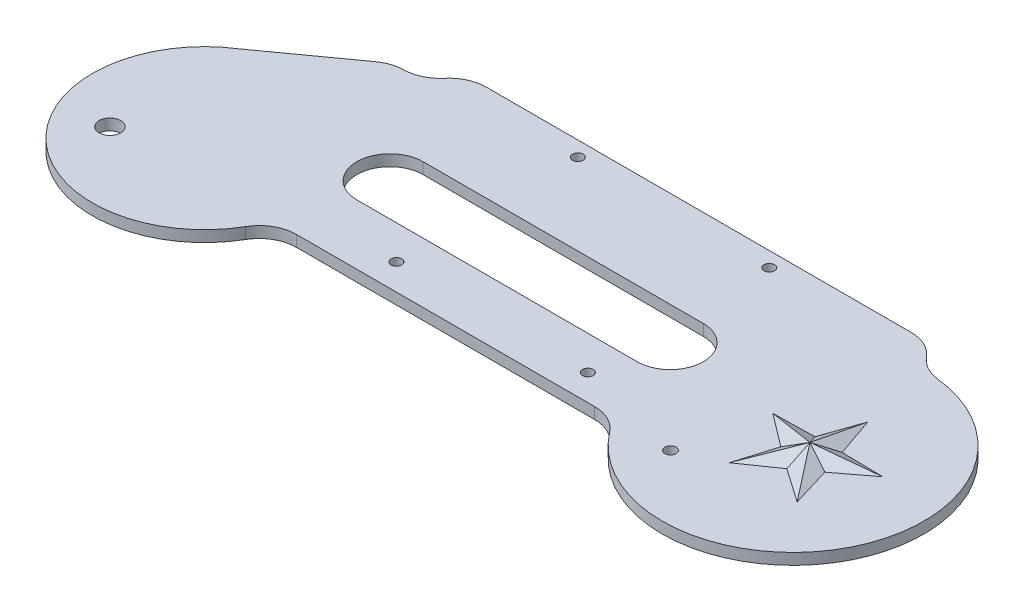
ISO-10303-21;
HEADER;
FILE_DESCRIPTION(('STEP AP214'),'2;1');
FILE_NAME('part.step','',(''),(''),'','','');
FILE_SCHEMA(('AUTOMOTIVE_DESIGN { 1 0 10303 214 1 1 1 1 }'));
ENDSEC;
DATA;
#1=APPLICATION_CONTEXT('core data for automotive mechanical design processes');
#2=APPLICATION_PROTOCOL_DEFINITION('international standard','automotive_design',2000,#1);
#3=PRODUCT_CONTEXT('',#1,'mechanical');
#4=PRODUCT('Part','Part','',(#3));
#5=PRODUCT_RELATED_PRODUCT_CATEGORY('part','',(#4));
#6=PRODUCT_DEFINITION_FORMATION('','',#4);
#7=PRODUCT_DEFINITION_CONTEXT('part definition',#1,'design');
#8=PRODUCT_DEFINITION('design','',#6,#7);
#9=PRODUCT_DEFINITION_SHAPE('','',#8);
#10=(LENGTH_UNIT() NAMED_UNIT(*) SI_UNIT(.MILLI.,.METRE.));
#11=(NAMED_UNIT(*) PLANE_ANGLE_UNIT() SI_UNIT($,.RADIAN.));
#12=(NAMED_UNIT(*) SI_UNIT($,.STERADIAN.) SOLID_ANGLE_UNIT());
#13=UNCERTAINTY_MEASURE_WITH_UNIT(LENGTH_MEASURE(1.E-05),#10,'distance_accuracy_value','');
#14=(GEOMETRIC_REPRESENTATION_CONTEXT(3) GLOBAL_UNCERTAINTY_ASSIGNED_CONTEXT((#13)) GLOBAL_UNIT_ASSIGNED_CONTEXT((#10,
#11,#12)) REPRESENTATION_CONTEXT('',''));
#15=CARTESIAN_POINT('',(0.,0.,0.));
#16=DIRECTION('',(0.,0.,1.));
#17=DIRECTION('',(1.,0.,0.));
#18=AXIS2_PLACEMENT_3D('',#15,#16,#17);
#19=CARTESIAN_POINT('',(0.,3.,0.));
#20=DIRECTION('',(0.,1.,0.));
#21=DIRECTION('',(0.,0.,1.));
#22=AXIS2_PLACEMENT_3D('',#19,#20,#21);
#23=PLANE('',#22);
#24=CARTESIAN_POINT('',(23.0885945787249,3.,10.5));
#25=DIRECTION('',(0.,1.,0.));
#26=DIRECTION('',(0.,0.,1.));
#27=AXIS2_PLACEMENT_3D('',#24,#25,#26);
#28=CIRCLE('',#27,1.42);
#29=CARTESIAN_POINT('',(23.0885945787249,3.,11.92));
#30=VERTEX_POINT('',#29);
#31=EDGE_CURVE('E393',#30,#30,#28,.T.);
#32=ORIENTED_EDGE('',*,*,#31,.F.);
#33=EDGE_LOOP('',(#32));
#34=FACE_BOUND('',#33,.T.);
#35=CARTESIAN_POINT('',(-28.1428113637631,3.,-38.0312499999994));
#36=DIRECTION('',(0.,1.,0.));
#37=DIRECTION('',(0.,0.,1.));
#38=AXIS2_PLACEMENT_3D('',#35,#36,#37);
#39=CIRCLE('',#38,1.42);
#40=CARTESIAN_POINT('',(-28.1428113637631,3.,-36.6112499999994));
#41=VERTEX_POINT('',#40);
#42=EDGE_CURVE('E860',#41,#41,#39,.T.);
#43=ORIENTED_EDGE('',*,*,#42,.F.);
#44=EDGE_LOOP('',(#43));
#45=FACE_BOUND('',#44,.T.);
#46=CARTESIAN_POINT('',(23.0885945787249,3.,-38.0312499999994));
#47=DIRECTION('',(0.,1.,0.));
#48=DIRECTION('',(0.,0.,1.));
#49=AXIS2_PLACEMENT_3D('',#46,#47,#48);
#50=CIRCLE('',#49,1.42);
#51=CARTESIAN_POINT('',(23.0885945787249,3.,-36.6112499999994));
#52=VERTEX_POINT('',#51);
#53=EDGE_CURVE('E406',#52,#52,#50,.T.);
#54=ORIENTED_EDGE('',*,*,#53,.F.);
#55=EDGE_LOOP('',(#54));
#56=FACE_BOUND('',#55,.T.);
#57=CARTESIAN_POINT('',(-28.1428113637631,3.,10.5));
#58=DIRECTION('',(0.,1.,0.));
#59=DIRECTION('',(0.,0.,1.));
#60=AXIS2_PLACEMENT_3D('',#57,#58,#59);
#61=CIRCLE('',#60,1.42);
#62=CARTESIAN_POINT('',(-28.1428113637631,3.,11.92));
#63=VERTEX_POINT('',#62);
#64=EDGE_CURVE('E389',#63,#63,#61,.T.);
#65=ORIENTED_EDGE('',*,*,#64,.F.);
#66=EDGE_LOOP('',(#65));
#67=FACE_BOUND('',#66,.T.);
#68=CARTESIAN_POINT('',(-47.8108891324553,3.,-7.44064455504656));
#69=DIRECTION('',(0.,1.,0.));
#70=DIRECTION('',(0.,0.,1.));
#71=AXIS2_PLACEMENT_3D('',#68,#69,#70);
#72=CIRCLE('',#71,8.85362955411395);
#73=CARTESIAN_POINT('',(-47.8108891324553,3.,-16.2942741091605));
#74=VERTEX_POINT('',#73);
#75=CARTESIAN_POINT('',(-47.8108891324553,3.,1.41298499906739));
#76=VERTEX_POINT('',#75);
#77=EDGE_CURVE('E388',#74,#76,#72,.T.);
#78=ORIENTED_EDGE('',*,*,#77,.F.);
#79=DIRECTION('',(-1.,0.,0.));
#80=VECTOR('',#79,1.);
#81=CARTESIAN_POINT('',(-47.8108891324553,3.,-16.2942741091605));
#82=LINE('',#81,#80);
#83=CARTESIAN_POINT('',(27.1891108675447,3.,-16.2942741091605));
#84=VERTEX_POINT('',#83);
#85=EDGE_CURVE('E415',#84,#74,#82,.T.);
#86=ORIENTED_EDGE('',*,*,#85,.F.);
#87=CARTESIAN_POINT('',(27.1891108675447,3.,-7.44064455504656));
#88=DIRECTION('',(0.,1.,0.));
#89=DIRECTION('',(0.,0.,1.));
#90=AXIS2_PLACEMENT_3D('',#87,#88,#89);
#91=CIRCLE('',#90,8.85362955411395);
#92=CARTESIAN_POINT('',(27.1891108675447,3.,1.41298499906739));
#93=VERTEX_POINT('',#92);
#94=EDGE_CURVE('E412',#93,#84,#91,.T.);
#95=ORIENTED_EDGE('',*,*,#94,.F.);
#96=DIRECTION('',(1.,0.,0.));
#97=VECTOR('',#96,1.);
#98=CARTESIAN_POINT('',(-47.8108891324553,3.,1.41298499906739));
#99=LINE('',#98,#97);
#100=EDGE_CURVE('E409',#76,#93,#99,.T.);
#101=ORIENTED_EDGE('',*,*,#100,.F.);
#102=EDGE_LOOP('',(#78,#86,#95,#101));
#103=FACE_BOUND('',#102,.T.);
#104=CARTESIAN_POINT('',(72.5358543288984,3.,-44.7173363605002));
#105=DIRECTION('',(0.,1.,0.));
#106=DIRECTION('',(0.,0.,1.));
#107=AXIS2_PLACEMENT_3D('',#104,#105,#106);
#108=CIRCLE('',#107,10.);
#109=CARTESIAN_POINT('',(71.4167755891432,3.,-34.7801505026113));
#110=VERTEX_POINT('',#109);
#111=CARTESIAN_POINT('',(64.8050197547093,3.,-38.3742931802498));
#112=VERTEX_POINT('',#111);
#113=EDGE_CURVE('E282',#110,#112,#108,.F.);
#114=ORIENTED_EDGE('',*,*,#113,.T.);
#115=CARTESIAN_POINT('',(57.0741851805201,3.,-32.0312499999994));
#116=DIRECTION('',(0.,1.,0.));
#117=DIRECTION('',(0.,0.,1.));
#118=AXIS2_PLACEMENT_3D('',#115,#116,#117);
#119=CIRCLE('',#118,10.);
#120=CARTESIAN_POINT('',(57.0741851805201,3.,-42.0312499999994));
#121=VERTEX_POINT('',#120);
#122=EDGE_CURVE('E306',#112,#121,#119,.T.);
#123=ORIENTED_EDGE('',*,*,#122,.T.);
#124=DIRECTION('',(1.,0.,0.));
#125=VECTOR('',#124,1.);
#126=CARTESIAN_POINT('',(1.37187431065676E-13,3.,-42.0312499999996));
#127=LINE('',#126,#125);
#128=CARTESIAN_POINT('',(-56.6243094957138,3.,-42.0312499999998));
#129=VERTEX_POINT('',#128);
#130=EDGE_CURVE('E349',#129,#121,#127,.T.);
#131=ORIENTED_EDGE('',*,*,#130,.F.);
#132=CARTESIAN_POINT('',(-56.6243094957138,3.,-32.0312499999998));
#133=DIRECTION('',(0.,1.,0.));
#134=DIRECTION('',(0.,0.,1.));
#135=AXIS2_PLACEMENT_3D('',#132,#133,#134);
#136=CIRCLE('',#135,10.);
#137=CARTESIAN_POINT('',(-64.2369884498915,3.,-38.5156249999994));
#138=VERTEX_POINT('',#137);
#139=EDGE_CURVE('E69',#129,#138,#136,.T.);
#140=ORIENTED_EDGE('',*,*,#139,.T.);
#141=CARTESIAN_POINT('',(-71.8496674040692,3.,-44.999999999999));
#142=DIRECTION('',(0.,1.,0.));
#143=DIRECTION('',(0.,0.,1.));
#144=AXIS2_PLACEMENT_3D('',#141,#142,#143);
#145=CIRCLE('',#144,10.);
#146=CARTESIAN_POINT('',(-71.6663204392618,3.,-35.0016809467533));
#147=VERTEX_POINT('',#146);
#148=EDGE_CURVE('E288',#138,#147,#145,.F.);
#149=ORIENTED_EDGE('',*,*,#148,.T.);
#150=CARTESIAN_POINT('',(-71.4829734744544,3.,-25.0033618935076));
#151=DIRECTION('',(0.,1.,0.));
#152=DIRECTION('',(0.,0.,1.));
#153=AXIS2_PLACEMENT_3D('',#150,#151,#152);
#154=CIRCLE('',#153,10.);
#155=CARTESIAN_POINT('',(-77.3268462241482,3.,-33.1181108905738));
#156=VERTEX_POINT('',#155);
#157=EDGE_CURVE('E303',#147,#156,#154,.T.);
#158=ORIENTED_EDGE('',*,*,#157,.T.);
#159=DIRECTION('',(-0.811474899706619,0.,0.584387274969375));
#160=VECTOR('',#159,1.);
#161=CARTESIAN_POINT('',(-42.1128992736665,3.,-58.4775921348465));
#162=LINE('',#161,#160);
#163=CARTESIAN_POINT('',(-98.423870831973,3.,-17.9249943505724));
#164=VERTEX_POINT('',#163);
#165=EDGE_CURVE('E327',#156,#164,#162,.T.);
#166=ORIENTED_EDGE('',*,*,#165,.T.);
#167=CARTESIAN_POINT('',(-82.5,3.,7.50000000000004));
#168=DIRECTION('',(0.,1.,0.));
#169=DIRECTION('',(0.,0.,1.));
#170=AXIS2_PLACEMENT_3D('',#167,#168,#169);
#171=CIRCLE('',#170,30.);
#172=CARTESIAN_POINT('',(-56.5192378864668,3.,22.5));
#173=VERTEX_POINT('',#172);
#174=EDGE_CURVE('E332',#164,#173,#171,.T.);
#175=ORIENTED_EDGE('',*,*,#174,.T.);
#176=CARTESIAN_POINT('',(-47.8589838486224,3.,27.5));
#177=DIRECTION('',(0.,1.,0.));
#178=DIRECTION('',(0.,0.,1.));
#179=AXIS2_PLACEMENT_3D('',#176,#177,#178);
#180=CIRCLE('',#179,10.);
#181=CARTESIAN_POINT('',(-47.8589838486224,3.,17.5));
#182=VERTEX_POINT('',#181);
#183=EDGE_CURVE('E276',#173,#182,#180,.F.);
#184=ORIENTED_EDGE('',*,*,#183,.T.);
#185=DIRECTION('',(1.,0.,0.));
#186=VECTOR('',#185,1.);
#187=CARTESIAN_POINT('',(0.,3.,17.5));
#188=LINE('',#187,#186);
#189=CARTESIAN_POINT('',(31.8804828780625,3.,17.5));
#190=VERTEX_POINT('',#189);
#191=EDGE_CURVE('E335',#182,#190,#188,.T.);
#192=ORIENTED_EDGE('',*,*,#191,.T.);
#193=CARTESIAN_POINT('',(31.8804828780625,3.,27.5));
#194=DIRECTION('',(0.,1.,0.));
#195=DIRECTION('',(0.,0.,1.));
#196=AXIS2_PLACEMENT_3D('',#193,#194,#195);
#197=CIRCLE('',#196,10.);
#198=CARTESIAN_POINT('',(39.7959311273819,3.,21.3888888888889));
#199=VERTEX_POINT('',#198);
#200=EDGE_CURVE('E272',#190,#199,#197,.F.);
#201=ORIENTED_EDGE('',*,*,#200,.T.);
#202=CARTESIAN_POINT('',(67.5,3.,0.));
#203=DIRECTION('',(0.,1.,0.));
#204=DIRECTION('',(0.,0.,1.));
#205=AXIS2_PLACEMENT_3D('',#202,#203,#204);
#206=CIRCLE('',#205,35.);
#207=EDGE_CURVE('E346',#199,#110,#206,.T.);
#208=ORIENTED_EDGE('',*,*,#207,.T.);
#209=EDGE_LOOP('',(#114,#123,#131,#140,#149,#158,#166,#175,#184,#192,#201,#208));
#210=FACE_BOUND('',#209,.T.);
#211=CARTESIAN_POINT('',(-97.8108891324553,3.,17.5));
#212=DIRECTION('',(0.,1.,0.));
#213=DIRECTION('',(0.,0.,1.));
#214=AXIS2_PLACEMENT_3D('',#211,#212,#213);
#215=CIRCLE('',#214,2.875);
#216=CARTESIAN_POINT('',(-97.8108891324553,3.,20.375));
#217=VERTEX_POINT('',#216);
#218=EDGE_CURVE('E352',#217,#217,#215,.T.);
#219=ORIENTED_EDGE('',*,*,#218,.F.);
#220=EDGE_LOOP('',(#219));
#221=FACE_BOUND('',#220,.T.);
#222=CARTESIAN_POINT('',(52.1891108675447,3.,17.5));
#223=DIRECTION('',(0.,1.,0.));
#224=DIRECTION('',(0.,0.,1.));
#225=AXIS2_PLACEMENT_3D('',#222,#223,#224);
#226=CIRCLE('',#225,1.5);
#227=CARTESIAN_POINT('',(52.1891108675447,3.,19.));
#228=VERTEX_POINT('',#227);
#229=EDGE_CURVE('E355',#228,#228,#226,.T.);
#230=ORIENTED_EDGE('',*,*,#229,.F.);
#231=EDGE_LOOP('',(#230));
#232=FACE_BOUND('',#231,.T.);
#233=DIRECTION('',(0.328329893281224,0.,0.944563116566564));
#234=VECTOR('',#233,1.);
#235=CARTESIAN_POINT('',(72.,3.,-15.4508497187474));
#236=LINE('',#235,#234);
#237=CARTESIAN_POINT('',(72.,3.,-15.4508497187474));
#238=VERTEX_POINT('',#237);
#239=CARTESIAN_POINT('',(75.6327126400267,3.,-5.00000000000004));
#240=VERTEX_POINT('',#239);
#241=EDGE_CURVE('E217',#238,#240,#236,.T.);
#242=ORIENTED_EDGE('',*,*,#241,.T.);
#243=DIRECTION('',(-0.9997924238479,0.,-0.0203742292207713));
#244=VECTOR('',#243,1.);
#245=CARTESIAN_POINT('',(86.6946313073118,3.,-4.77457514062635));
#246=LINE('',#245,#244);
#247=CARTESIAN_POINT('',(86.6946313073118,3.,-4.77457514062635));
#248=VERTEX_POINT('',#247);
#249=EDGE_CURVE('E200',#248,#240,#246,.T.);
#250=ORIENTED_EDGE('',*,*,#249,.F.);
#251=DIRECTION('',(-0.796873390277476,0.,0.604146339778436));
#252=VECTOR('',#251,1.);
#253=CARTESIAN_POINT('',(86.6946313073118,3.,-4.77457514062635));
#254=LINE('',#253,#252);
#255=CARTESIAN_POINT('',(77.8778525229248,3.,1.90983005625049));
#256=VERTEX_POINT('',#255);
#257=EDGE_CURVE('E206',#248,#256,#254,.T.);
#258=ORIENTED_EDGE('',*,*,#257,.T.);
#259=DIRECTION('',(-0.289575806351414,0.,-0.957155082719581));
#260=VECTOR('',#259,1.);
#261=CARTESIAN_POINT('',(81.081781600067,3.,12.5));
#262=LINE('',#261,#260);
#263=CARTESIAN_POINT('',(81.081781600067,3.,12.5));
#264=VERTEX_POINT('',#263);
#265=EDGE_CURVE('E214',#264,#256,#262,.T.);
#266=ORIENTED_EDGE('',*,*,#265,.F.);
#267=DIRECTION('',(0.820824733203066,0.,0.571180144404649));
#268=VECTOR('',#267,1.);
#269=CARTESIAN_POINT('',(72.0000000000001,3.,6.18033988749896));
#270=LINE('',#269,#268);
#271=CARTESIAN_POINT('',(72.0000000000001,3.,6.18033988749896));
#272=VERTEX_POINT('',#271);
#273=EDGE_CURVE('E230',#272,#264,#270,.T.);
#274=ORIENTED_EDGE('',*,*,#273,.F.);
#275=DIRECTION('',(-0.820824733203067,0.,0.571180144404647));
#276=VECTOR('',#275,1.);
#277=CARTESIAN_POINT('',(72.0000000000001,3.,6.18033988749896));
#278=LINE('',#277,#276);
#279=CARTESIAN_POINT('',(62.918218399933,3.,12.5));
#280=VERTEX_POINT('',#279);
#281=EDGE_CURVE('E234',#272,#280,#278,.T.);
#282=ORIENTED_EDGE('',*,*,#281,.T.);
#283=DIRECTION('',(-0.289575806351416,0.,0.95715508271958));
#284=VECTOR('',#283,1.);
#285=CARTESIAN_POINT('',(66.1221474770753,3.,1.90983005625058));
#286=LINE('',#285,#284);
#287=CARTESIAN_POINT('',(66.1221474770753,3.,1.90983005625058));
#288=VERTEX_POINT('',#287);
#289=EDGE_CURVE('E239',#288,#280,#286,.T.);
#290=ORIENTED_EDGE('',*,*,#289,.F.);
#291=DIRECTION('',(-0.796873390277476,0.,-0.604146339778437));
#292=VECTOR('',#291,1.);
#293=CARTESIAN_POINT('',(66.1221474770753,3.,1.90983005625058));
#294=LINE('',#293,#292);
#295=CARTESIAN_POINT('',(57.3053686926882,3.,-4.7745751406263));
#296=VERTEX_POINT('',#295);
#297=EDGE_CURVE('E243',#288,#296,#294,.T.);
#298=ORIENTED_EDGE('',*,*,#297,.T.);
#299=DIRECTION('',(-0.9997924238479,0.,0.0203742292207686));
#300=VECTOR('',#299,1.);
#301=CARTESIAN_POINT('',(68.3672873599731,3.,-4.99999999999996));
#302=LINE('',#301,#300);
#303=CARTESIAN_POINT('',(68.3672873599731,3.,-4.99999999999996));
#304=VERTEX_POINT('',#303);
#305=EDGE_CURVE('E248',#304,#296,#302,.T.);
#306=ORIENTED_EDGE('',*,*,#305,.F.);
#307=DIRECTION('',(0.328329893281229,0.,-0.944563116566562));
#308=VECTOR('',#307,1.);
#309=CARTESIAN_POINT('',(68.3672873599731,3.,-4.99999999999996));
#310=LINE('',#309,#308);
#311=EDGE_CURVE('E219',#304,#238,#310,.T.);
#312=ORIENTED_EDGE('',*,*,#311,.T.);
#313=EDGE_LOOP('',(#242,#250,#258,#266,#274,#282,#290,#298,#306,#312));
#314=FACE_BOUND('',#313,.T.);
#315=ADVANCED_FACE('F47',(#34,#45,#56,#67,#103,#210,#221,#232,#314),#23,.T.);
#316=CARTESIAN_POINT('',(-42.1128992736665,3.,-58.4775921348465));
#317=DIRECTION('',(0.584387274969375,0.,0.811474899706619));
#318=DIRECTION('',(0.811474899706619,0.,-0.584387274969375));
#319=AXIS2_PLACEMENT_3D('',#316,#317,#318);
#320=PLANE('',#319);
#321=ORIENTED_EDGE('',*,*,#165,.F.);
#322=DIRECTION('',(0.,1.,0.));
#323=VECTOR('',#322,1.);
#324=CARTESIAN_POINT('',(-77.3268462241481,3.,-33.1181108905738));
#325=LINE('',#324,#323);
#326=CARTESIAN_POINT('',(-77.3268462241482,0.,-33.1181108905738));
#327=VERTEX_POINT('',#326);
#328=EDGE_CURVE('E12',#156,#327,#325,.F.);
#329=ORIENTED_EDGE('',*,*,#328,.T.);
#330=DIRECTION('',(-0.811474899706619,0.,0.584387274969375));
#331=VECTOR('',#330,1.);
#332=CARTESIAN_POINT('',(-42.1128992736665,0.,-58.4775921348465));
#333=LINE('',#332,#331);
#334=CARTESIAN_POINT('',(-98.423870831973,0.,-17.9249943505724));
#335=VERTEX_POINT('',#334);
#336=EDGE_CURVE('E319',#327,#335,#333,.T.);
#337=ORIENTED_EDGE('',*,*,#336,.T.);
#338=DIRECTION('',(0.,-1.,0.));
#339=VECTOR('',#338,1.);
#340=CARTESIAN_POINT('',(-98.423870831973,3.,-17.9249943505724));
#341=LINE('',#340,#339);
#342=EDGE_CURVE('E329',#164,#335,#341,.T.);
#343=ORIENTED_EDGE('',*,*,#342,.F.);
#344=EDGE_LOOP('',(#321,#329,#337,#343));
#345=FACE_BOUND('',#344,.T.);
#346=ADVANCED_FACE('F325',(#345),#320,.F.);
#347=CARTESIAN_POINT('',(-82.5,3.,7.50000000000004));
#348=DIRECTION('',(0.,-1.,0.));
#349=DIRECTION('',(0.,0.,-1.));
#350=AXIS2_PLACEMENT_3D('',#347,#348,#349);
#351=CYLINDRICAL_SURFACE('',#350,30.);
#352=CARTESIAN_POINT('',(-82.5,0.,7.50000000000004));
#353=DIRECTION('',(0.,1.,0.));
#354=DIRECTION('',(0.,0.,1.));
#355=AXIS2_PLACEMENT_3D('',#352,#353,#354);
#356=CIRCLE('',#355,30.);
#357=CARTESIAN_POINT('',(-56.5192378864668,0.,22.5));
#358=VERTEX_POINT('',#357);
#359=EDGE_CURVE('E359',#335,#358,#356,.T.);
#360=ORIENTED_EDGE('',*,*,#359,.T.);
#361=DIRECTION('',(0.,-1.,0.));
#362=VECTOR('',#361,1.);
#363=CARTESIAN_POINT('',(-56.5192378864668,3.,22.5));
#364=LINE('',#363,#362);
#365=EDGE_CURVE('E268',#358,#173,#364,.F.);
#366=ORIENTED_EDGE('',*,*,#365,.T.);
#367=ORIENTED_EDGE('',*,*,#174,.F.);
#368=ORIENTED_EDGE('',*,*,#342,.T.);
#369=EDGE_LOOP('',(#360,#366,#367,#368));
#370=FACE_BOUND('',#369,.T.);
#371=ADVANCED_FACE('F456',(#370),#351,.T.);
#372=CARTESIAN_POINT('',(0.,3.,17.5));
#373=DIRECTION('',(0.,0.,-1.));
#374=DIRECTION('',(-1.,0.,0.));
#375=AXIS2_PLACEMENT_3D('',#372,#373,#374);
#376=PLANE('',#375);
#377=DIRECTION('',(1.,0.,0.));
#378=VECTOR('',#377,1.);
#379=CARTESIAN_POINT('',(0.,0.,17.5));
#380=LINE('',#379,#378);
#381=CARTESIAN_POINT('',(-47.8589838486224,0.,17.5));
#382=VERTEX_POINT('',#381);
#383=CARTESIAN_POINT('',(31.8804828780625,0.,17.5));
#384=VERTEX_POINT('',#383);
#385=EDGE_CURVE('E363',#382,#384,#380,.T.);
#386=ORIENTED_EDGE('',*,*,#385,.T.);
#387=DIRECTION('',(0.,1.,0.));
#388=VECTOR('',#387,1.);
#389=CARTESIAN_POINT('',(31.8804828780625,3.,17.5));
#390=LINE('',#389,#388);
#391=EDGE_CURVE('E266',#384,#190,#390,.T.);
#392=ORIENTED_EDGE('',*,*,#391,.T.);
#393=ORIENTED_EDGE('',*,*,#191,.F.);
#394=DIRECTION('',(0.,1.,0.));
#395=VECTOR('',#394,1.);
#396=CARTESIAN_POINT('',(-47.8589838486224,0.,17.5));
#397=LINE('',#396,#395);
#398=EDGE_CURVE('E262',#182,#382,#397,.F.);
#399=ORIENTED_EDGE('',*,*,#398,.T.);
#400=EDGE_LOOP('',(#386,#392,#393,#399));
#401=FACE_BOUND('',#400,.T.);
#402=ADVANCED_FACE('F478',(#401),#376,.F.);
#403=CARTESIAN_POINT('',(67.5,3.,0.));
#404=DIRECTION('',(0.,-1.,0.));
#405=DIRECTION('',(0.,0.,-1.));
#406=AXIS2_PLACEMENT_3D('',#403,#404,#405);
#407=CYLINDRICAL_SURFACE('',#406,35.);
#408=CARTESIAN_POINT('',(67.5,0.,0.));
#409=DIRECTION('',(0.,1.,0.));
#410=DIRECTION('',(0.,0.,1.));
#411=AXIS2_PLACEMENT_3D('',#408,#409,#410);
#412=CIRCLE('',#411,35.);
#413=CARTESIAN_POINT('',(39.7959311273819,0.,21.3888888888889));
#414=VERTEX_POINT('',#413);
#415=CARTESIAN_POINT('',(71.4167755891432,0.,-34.7801505026113));
#416=VERTEX_POINT('',#415);
#417=EDGE_CURVE('E366',#414,#416,#412,.T.);
#418=ORIENTED_EDGE('',*,*,#417,.T.);
#419=DIRECTION('',(0.,-1.,0.));
#420=VECTOR('',#419,1.);
#421=CARTESIAN_POINT('',(71.4167755891432,3.,-34.7801505026113));
#422=LINE('',#421,#420);
#423=EDGE_CURVE('E278',#416,#110,#422,.F.);
#424=ORIENTED_EDGE('',*,*,#423,.T.);
#425=ORIENTED_EDGE('',*,*,#207,.F.);
#426=DIRECTION('',(0.,-1.,0.));
#427=VECTOR('',#426,1.);
#428=CARTESIAN_POINT('',(39.7959311273819,3.,21.3888888888889));
#429=LINE('',#428,#427);
#430=EDGE_CURVE('E259',#199,#414,#429,.T.);
#431=ORIENTED_EDGE('',*,*,#430,.T.);
#432=EDGE_LOOP('',(#418,#424,#425,#431));
#433=FACE_BOUND('',#432,.T.);
#434=ADVANCED_FACE('F475',(#433),#407,.T.);
#435=CARTESIAN_POINT('',(1.37187431065676E-13,3.,-42.0312499999996));
#436=DIRECTION('',(0.,0.,-1.));
#437=DIRECTION('',(-1.,0.,0.));
#438=AXIS2_PLACEMENT_3D('',#435,#436,#437);
#439=PLANE('',#438);
#440=ORIENTED_EDGE('',*,*,#130,.T.);
#441=DIRECTION('',(0.,1.,0.));
#442=VECTOR('',#441,1.);
#443=CARTESIAN_POINT('',(57.0741851805201,0.,-42.0312499999994));
#444=LINE('',#443,#442);
#445=CARTESIAN_POINT('',(57.0741851805201,0.,-42.0312499999994));
#446=VERTEX_POINT('',#445);
#447=EDGE_CURVE('E292',#121,#446,#444,.F.);
#448=ORIENTED_EDGE('',*,*,#447,.T.);
#449=DIRECTION('',(1.,0.,0.));
#450=VECTOR('',#449,1.);
#451=CARTESIAN_POINT('',(1.37187431065676E-13,0.,-42.0312499999996));
#452=LINE('',#451,#450);
#453=CARTESIAN_POINT('',(-56.6243094957138,0.,-42.0312499999998));
#454=VERTEX_POINT('',#453);
#455=EDGE_CURVE('E369',#454,#446,#452,.T.);
#456=ORIENTED_EDGE('',*,*,#455,.F.);
#457=DIRECTION('',(0.,-1.,0.));
#458=VECTOR('',#457,1.);
#459=CARTESIAN_POINT('',(-56.6243094957138,3.,-42.0312499999998));
#460=LINE('',#459,#458);
#461=EDGE_CURVE('E290',#454,#129,#460,.F.);
#462=ORIENTED_EDGE('',*,*,#461,.T.);
#463=EDGE_LOOP('',(#440,#448,#456,#462));
#464=FACE_BOUND('',#463,.T.);
#465=ADVANCED_FACE('F471',(#464),#439,.T.);
#466=CARTESIAN_POINT('',(-97.8108891324553,3.,17.5));
#467=DIRECTION('',(0.,-1.,0.));
#468=DIRECTION('',(0.,0.,-1.));
#469=AXIS2_PLACEMENT_3D('',#466,#467,#468);
#470=CYLINDRICAL_SURFACE('',#469,2.875);
#471=ORIENTED_EDGE('',*,*,#218,.T.);
#472=EDGE_LOOP('',(#471));
#473=FACE_BOUND('',#472,.T.);
#474=CARTESIAN_POINT('',(-97.8108891324553,0.,17.5));
#475=DIRECTION('',(0.,1.,0.));
#476=DIRECTION('',(0.,0.,1.));
#477=AXIS2_PLACEMENT_3D('',#474,#475,#476);
#478=CIRCLE('',#477,2.875);
#479=CARTESIAN_POINT('',(-97.8108891324553,0.,20.375));
#480=VERTEX_POINT('',#479);
#481=EDGE_CURVE('E338',#480,#480,#478,.T.);
#482=ORIENTED_EDGE('',*,*,#481,.F.);
#483=EDGE_LOOP('',(#482));
#484=FACE_BOUND('',#483,.T.);
#485=ADVANCED_FACE('F467',(#473,#484),#470,.F.);
#486=CARTESIAN_POINT('',(52.1891108675447,3.,17.5));
#487=DIRECTION('',(0.,-1.,0.));
#488=DIRECTION('',(0.,0.,-1.));
#489=AXIS2_PLACEMENT_3D('',#486,#487,#488);
#490=CYLINDRICAL_SURFACE('',#489,1.5);
#491=ORIENTED_EDGE('',*,*,#229,.T.);
#492=EDGE_LOOP('',(#491));
#493=FACE_BOUND('',#492,.T.);
#494=CARTESIAN_POINT('',(52.1891108675447,0.,17.5));
#495=DIRECTION('',(0.,1.,0.));
#496=DIRECTION('',(0.,0.,1.));
#497=AXIS2_PLACEMENT_3D('',#494,#495,#496);
#498=CIRCLE('',#497,1.5);
#499=CARTESIAN_POINT('',(52.1891108675447,0.,19.));
#500=VERTEX_POINT('',#499);
#501=EDGE_CURVE('E333',#500,#500,#498,.T.);
#502=ORIENTED_EDGE('',*,*,#501,.F.);
#503=EDGE_LOOP('',(#502));
#504=FACE_BOUND('',#503,.T.);
#505=ADVANCED_FACE('F464',(#493,#504),#490,.F.);
#506=CARTESIAN_POINT('',(0.,0.,0.));
#507=DIRECTION('',(0.,1.,0.));
#508=DIRECTION('',(0.,0.,1.));
#509=AXIS2_PLACEMENT_3D('',#506,#507,#508);
#510=PLANE('',#509);
#511=CARTESIAN_POINT('',(23.0885945787249,0.,10.5));
#512=DIRECTION('',(0.,1.,0.));
#513=DIRECTION('',(0.,0.,1.));
#514=AXIS2_PLACEMENT_3D('',#511,#512,#513);
#515=CIRCLE('',#514,1.42);
#516=CARTESIAN_POINT('',(23.0885945787249,0.,11.92));
#517=VERTEX_POINT('',#516);
#518=EDGE_CURVE('E223',#517,#517,#515,.T.);
#519=ORIENTED_EDGE('',*,*,#518,.T.);
#520=EDGE_LOOP('',(#519));
#521=FACE_BOUND('',#520,.T.);
#522=CARTESIAN_POINT('',(-28.1428113637631,0.,-38.0312499999994));
#523=DIRECTION('',(0.,1.,0.));
#524=DIRECTION('',(0.,0.,1.));
#525=AXIS2_PLACEMENT_3D('',#522,#523,#524);
#526=CIRCLE('',#525,1.42);
#527=CARTESIAN_POINT('',(-28.1428113637631,0.,-36.6112499999994));
#528=VERTEX_POINT('',#527);
#529=EDGE_CURVE('E392',#528,#528,#526,.T.);
#530=ORIENTED_EDGE('',*,*,#529,.T.);
#531=EDGE_LOOP('',(#530));
#532=FACE_BOUND('',#531,.T.);
#533=CARTESIAN_POINT('',(23.0885945787249,0.,-38.0312499999994));
#534=DIRECTION('',(0.,1.,0.));
#535=DIRECTION('',(0.,0.,1.));
#536=AXIS2_PLACEMENT_3D('',#533,#534,#535);
#537=CIRCLE('',#536,1.42);
#538=CARTESIAN_POINT('',(23.0885945787249,0.,-36.6112499999994));
#539=VERTEX_POINT('',#538);
#540=EDGE_CURVE('E390',#539,#539,#537,.T.);
#541=ORIENTED_EDGE('',*,*,#540,.T.);
#542=EDGE_LOOP('',(#541));
#543=FACE_BOUND('',#542,.T.);
#544=CARTESIAN_POINT('',(-28.1428113637631,0.,10.5));
#545=DIRECTION('',(0.,1.,0.));
#546=DIRECTION('',(0.,0.,1.));
#547=AXIS2_PLACEMENT_3D('',#544,#545,#546);
#548=CIRCLE('',#547,1.42);
#549=CARTESIAN_POINT('',(-28.1428113637631,0.,11.92));
#550=VERTEX_POINT('',#549);
#551=EDGE_CURVE('E385',#550,#550,#548,.T.);
#552=ORIENTED_EDGE('',*,*,#551,.T.);
#553=EDGE_LOOP('',(#552));
#554=FACE_BOUND('',#553,.T.);
#555=DIRECTION('',(-1.,0.,0.));
#556=VECTOR('',#555,1.);
#557=CARTESIAN_POINT('',(0.,0.,-16.2942741091605));
#558=LINE('',#557,#556);
#559=CARTESIAN_POINT('',(27.1891108675447,0.,-16.2942741091605));
#560=VERTEX_POINT('',#559);
#561=CARTESIAN_POINT('',(-47.8108891324553,0.,-16.2942741091605));
#562=VERTEX_POINT('',#561);
#563=EDGE_CURVE('E380',#560,#562,#558,.T.);
#564=ORIENTED_EDGE('',*,*,#563,.T.);
#565=CARTESIAN_POINT('',(-47.8108891324553,0.,-7.44064455504656));
#566=DIRECTION('',(0.,1.,0.));
#567=DIRECTION('',(0.,0.,1.));
#568=AXIS2_PLACEMENT_3D('',#565,#566,#567);
#569=CIRCLE('',#568,8.85362955411395);
#570=CARTESIAN_POINT('',(-47.8108891324553,0.,1.41298499906739));
#571=VERTEX_POINT('',#570);
#572=EDGE_CURVE('E263',#562,#571,#569,.T.);
#573=ORIENTED_EDGE('',*,*,#572,.T.);
#574=DIRECTION('',(1.,0.,0.));
#575=VECTOR('',#574,1.);
#576=CARTESIAN_POINT('',(0.,0.,1.41298499906739));
#577=LINE('',#576,#575);
#578=CARTESIAN_POINT('',(27.1891108675447,0.,1.41298499906739));
#579=VERTEX_POINT('',#578);
#580=EDGE_CURVE('E374',#571,#579,#577,.T.);
#581=ORIENTED_EDGE('',*,*,#580,.T.);
#582=CARTESIAN_POINT('',(27.1891108675447,0.,-7.44064455504656));
#583=DIRECTION('',(0.,1.,0.));
#584=DIRECTION('',(0.,0.,1.));
#585=AXIS2_PLACEMENT_3D('',#582,#583,#584);
#586=CIRCLE('',#585,8.85362955411395);
#587=EDGE_CURVE('E377',#579,#560,#586,.T.);
#588=ORIENTED_EDGE('',*,*,#587,.T.);
#589=EDGE_LOOP('',(#564,#573,#581,#588));
#590=FACE_BOUND('',#589,.T.);
#591=ORIENTED_EDGE('',*,*,#455,.T.);
#592=CARTESIAN_POINT('',(57.0741851805201,0.,-32.0312499999994));
#593=DIRECTION('',(0.,1.,0.));
#594=DIRECTION('',(0.,0.,1.));
#595=AXIS2_PLACEMENT_3D('',#592,#593,#594);
#596=CIRCLE('',#595,10.);
#597=CARTESIAN_POINT('',(64.8050197547093,0.,-38.3742931802498));
#598=VERTEX_POINT('',#597);
#599=EDGE_CURVE('E299',#446,#598,#596,.F.);
#600=ORIENTED_EDGE('',*,*,#599,.T.);
#601=CARTESIAN_POINT('',(72.5358543288984,0.,-44.7173363605002));
#602=DIRECTION('',(0.,1.,0.));
#603=DIRECTION('',(0.,0.,1.));
#604=AXIS2_PLACEMENT_3D('',#601,#602,#603);
#605=CIRCLE('',#604,10.);
#606=EDGE_CURVE('E280',#598,#416,#605,.T.);
#607=ORIENTED_EDGE('',*,*,#606,.T.);
#608=ORIENTED_EDGE('',*,*,#417,.F.);
#609=CARTESIAN_POINT('',(31.8804828780625,0.,27.5));
#610=DIRECTION('',(0.,1.,0.));
#611=DIRECTION('',(0.,0.,1.));
#612=AXIS2_PLACEMENT_3D('',#609,#610,#611);
#613=CIRCLE('',#612,10.);
#614=EDGE_CURVE('E270',#414,#384,#613,.T.);
#615=ORIENTED_EDGE('',*,*,#614,.T.);
#616=ORIENTED_EDGE('',*,*,#385,.F.);
#617=CARTESIAN_POINT('',(-47.8589838486224,0.,27.5));
#618=DIRECTION('',(0.,1.,0.));
#619=DIRECTION('',(0.,0.,1.));
#620=AXIS2_PLACEMENT_3D('',#617,#618,#619);
#621=CIRCLE('',#620,10.);
#622=EDGE_CURVE('E274',#382,#358,#621,.T.);
#623=ORIENTED_EDGE('',*,*,#622,.T.);
#624=ORIENTED_EDGE('',*,*,#359,.F.);
#625=ORIENTED_EDGE('',*,*,#336,.F.);
#626=CARTESIAN_POINT('',(-71.4829734744544,0.,-25.0033618935076));
#627=DIRECTION('',(0.,1.,0.));
#628=DIRECTION('',(0.,0.,1.));
#629=AXIS2_PLACEMENT_3D('',#626,#627,#628);
#630=CIRCLE('',#629,10.);
#631=CARTESIAN_POINT('',(-71.6663204392618,0.,-35.0016809467533));
#632=VERTEX_POINT('',#631);
#633=EDGE_CURVE('E295',#327,#632,#630,.F.);
#634=ORIENTED_EDGE('',*,*,#633,.T.);
#635=CARTESIAN_POINT('',(-71.8496674040692,0.,-44.999999999999));
#636=DIRECTION('',(0.,1.,0.));
#637=DIRECTION('',(0.,0.,1.));
#638=AXIS2_PLACEMENT_3D('',#635,#636,#637);
#639=CIRCLE('',#638,10.);
#640=CARTESIAN_POINT('',(-64.2369884498915,0.,-38.5156249999994));
#641=VERTEX_POINT('',#640);
#642=EDGE_CURVE('E285',#632,#641,#639,.T.);
#643=ORIENTED_EDGE('',*,*,#642,.T.);
#644=CARTESIAN_POINT('',(-56.6243094957138,0.,-32.0312499999998));
#645=DIRECTION('',(0.,1.,0.));
#646=DIRECTION('',(0.,0.,1.));
#647=AXIS2_PLACEMENT_3D('',#644,#645,#646);
#648=CIRCLE('',#647,10.);
#649=EDGE_CURVE('E297',#641,#454,#648,.F.);
#650=ORIENTED_EDGE('',*,*,#649,.T.);
#651=EDGE_LOOP('',(#591,#600,#607,#608,#615,#616,#623,#624,#625,#634,#643,#650));
#652=FACE_BOUND('',#651,.T.);
#653=ORIENTED_EDGE('',*,*,#481,.T.);
#654=EDGE_LOOP('',(#653));
#655=FACE_BOUND('',#654,.T.);
#656=ORIENTED_EDGE('',*,*,#501,.T.);
#657=EDGE_LOOP('',(#656));
#658=FACE_BOUND('',#657,.T.);
#659=ADVANCED_FACE('F314',(#521,#532,#543,#554,#590,#652,#655,#658),#510,.F.);
#660=CARTESIAN_POINT('',(-47.8108891324553,-7.,-7.44064455504656));
#661=DIRECTION('',(0.,1.,0.));
#662=DIRECTION('',(0.,0.,1.));
#663=AXIS2_PLACEMENT_3D('',#660,#661,#662);
#664=CYLINDRICAL_SURFACE('',#663,8.85362955411395);
#665=DIRECTION('',(0.,1.,0.));
#666=VECTOR('',#665,1.);
#667=CARTESIAN_POINT('',(-47.8108891324553,-7.,-16.2942741091605));
#668=LINE('',#667,#666);
#669=EDGE_CURVE('E360',#562,#74,#668,.T.);
#670=ORIENTED_EDGE('',*,*,#669,.T.);
#671=ORIENTED_EDGE('',*,*,#77,.T.);
#672=DIRECTION('',(0.,1.,0.));
#673=VECTOR('',#672,1.);
#674=CARTESIAN_POINT('',(-47.8108891324553,-7.,1.41298499906739));
#675=LINE('',#674,#673);
#676=EDGE_CURVE('E341',#571,#76,#675,.T.);
#677=ORIENTED_EDGE('',*,*,#676,.F.);
#678=ORIENTED_EDGE('',*,*,#572,.F.);
#679=EDGE_LOOP('',(#670,#671,#677,#678));
#680=FACE_BOUND('',#679,.T.);
#681=ADVANCED_FACE('F438',(#680),#664,.F.);
#682=CARTESIAN_POINT('',(-47.8108891324553,-7.,-16.2942741091605));
#683=DIRECTION('',(0.,0.,-1.));
#684=DIRECTION('',(-1.,0.,0.));
#685=AXIS2_PLACEMENT_3D('',#682,#683,#684);
#686=PLANE('',#685);
#687=DIRECTION('',(0.,1.,0.));
#688=VECTOR('',#687,1.);
#689=CARTESIAN_POINT('',(27.1891108675447,-7.,-16.2942741091605));
#690=LINE('',#689,#688);
#691=EDGE_CURVE('E419',#560,#84,#690,.T.);
#692=ORIENTED_EDGE('',*,*,#691,.T.);
#693=ORIENTED_EDGE('',*,*,#85,.T.);
#694=ORIENTED_EDGE('',*,*,#669,.F.);
#695=ORIENTED_EDGE('',*,*,#563,.F.);
#696=EDGE_LOOP('',(#692,#693,#694,#695));
#697=FACE_BOUND('',#696,.T.);
#698=ADVANCED_FACE('F439',(#697),#686,.F.);
#699=CARTESIAN_POINT('',(27.1891108675447,-7.,-7.44064455504656));
#700=DIRECTION('',(0.,1.,0.));
#701=DIRECTION('',(0.,0.,1.));
#702=AXIS2_PLACEMENT_3D('',#699,#700,#701);
#703=CYLINDRICAL_SURFACE('',#702,8.85362955411395);
#704=DIRECTION('',(0.,1.,0.));
#705=VECTOR('',#704,1.);
#706=CARTESIAN_POINT('',(27.1891108675447,-7.,1.41298499906739));
#707=LINE('',#706,#705);
#708=EDGE_CURVE('E420',#579,#93,#707,.T.);
#709=ORIENTED_EDGE('',*,*,#708,.T.);
#710=ORIENTED_EDGE('',*,*,#94,.T.);
#711=ORIENTED_EDGE('',*,*,#691,.F.);
#712=ORIENTED_EDGE('',*,*,#587,.F.);
#713=EDGE_LOOP('',(#709,#710,#711,#712));
#714=FACE_BOUND('',#713,.T.);
#715=ADVANCED_FACE('F434',(#714),#703,.F.);
#716=CARTESIAN_POINT('',(-47.8108891324553,-7.,1.41298499906739));
#717=DIRECTION('',(0.,0.,1.));
#718=DIRECTION('',(1.,0.,0.));
#719=AXIS2_PLACEMENT_3D('',#716,#717,#718);
#720=PLANE('',#719);
#721=ORIENTED_EDGE('',*,*,#676,.T.);
#722=ORIENTED_EDGE('',*,*,#100,.T.);
#723=ORIENTED_EDGE('',*,*,#708,.F.);
#724=ORIENTED_EDGE('',*,*,#580,.F.);
#725=EDGE_LOOP('',(#721,#722,#723,#724));
#726=FACE_BOUND('',#725,.T.);
#727=ADVANCED_FACE('F427',(#726),#720,.F.);
#728=CARTESIAN_POINT('',(-28.1428113637631,-17.,10.5));
#729=DIRECTION('',(0.,1.,0.));
#730=DIRECTION('',(0.,0.,1.));
#731=AXIS2_PLACEMENT_3D('',#728,#729,#730);
#732=CYLINDRICAL_SURFACE('',#731,1.42);
#733=ORIENTED_EDGE('',*,*,#64,.T.);
#734=EDGE_LOOP('',(#733));
#735=FACE_BOUND('',#734,.T.);
#736=ORIENTED_EDGE('',*,*,#551,.F.);
#737=EDGE_LOOP('',(#736));
#738=FACE_BOUND('',#737,.T.);
#739=ADVANCED_FACE('F701',(#735,#738),#732,.F.);
#740=CARTESIAN_POINT('',(23.0885945787249,-17.,-38.0312499999994));
#741=DIRECTION('',(0.,1.,0.));
#742=DIRECTION('',(0.,0.,1.));
#743=AXIS2_PLACEMENT_3D('',#740,#741,#742);
#744=CYLINDRICAL_SURFACE('',#743,1.42);
#745=ORIENTED_EDGE('',*,*,#53,.T.);
#746=EDGE_LOOP('',(#745));
#747=FACE_BOUND('',#746,.T.);
#748=ORIENTED_EDGE('',*,*,#540,.F.);
#749=EDGE_LOOP('',(#748));
#750=FACE_BOUND('',#749,.T.);
#751=ADVANCED_FACE('F693',(#747,#750),#744,.F.);
#752=CARTESIAN_POINT('',(-28.1428113637631,-17.,-38.0312499999994));
#753=DIRECTION('',(0.,1.,0.));
#754=DIRECTION('',(0.,0.,1.));
#755=AXIS2_PLACEMENT_3D('',#752,#753,#754);
#756=CYLINDRICAL_SURFACE('',#755,1.42);
#757=ORIENTED_EDGE('',*,*,#42,.T.);
#758=EDGE_LOOP('',(#757));
#759=FACE_BOUND('',#758,.T.);
#760=ORIENTED_EDGE('',*,*,#529,.F.);
#761=EDGE_LOOP('',(#760));
#762=FACE_BOUND('',#761,.T.);
#763=ADVANCED_FACE('F685',(#759,#762),#756,.F.);
#764=CARTESIAN_POINT('',(23.0885945787249,-17.,10.5));
#765=DIRECTION('',(0.,1.,0.));
#766=DIRECTION('',(0.,0.,1.));
#767=AXIS2_PLACEMENT_3D('',#764,#765,#766);
#768=CYLINDRICAL_SURFACE('',#767,1.42);
#769=ORIENTED_EDGE('',*,*,#31,.T.);
#770=EDGE_LOOP('',(#769));
#771=FACE_BOUND('',#770,.T.);
#772=ORIENTED_EDGE('',*,*,#518,.F.);
#773=EDGE_LOOP('',(#772));
#774=FACE_BOUND('',#773,.T.);
#775=ADVANCED_FACE('F678',(#771,#774),#768,.F.);
#776=CARTESIAN_POINT('',(0.061304998913206,5.08810705495768,-3.00832354408482));
#777=DIRECTION('',(0.01037094346289,0.860753144695528,-0.508916955335984));
#778=DIRECTION('',(0.,0.508944326199129,0.860799438214103));
#779=AXIS2_PLACEMENT_3D('',#776,#777,#778);
#780=PLANE('',#779);
#781=DIRECTION('',(0.93362072140095,-0.190604453124944,-0.303351761194345));
#782=VECTOR('',#781,1.);
#783=CARTESIAN_POINT('',(72.,6.,0.));
#784=LINE('',#783,#782);
#785=CARTESIAN_POINT('',(72.,6.,0.));
#786=VERTEX_POINT('',#785);
#787=EDGE_CURVE('E196',#786,#248,#784,.T.);
#788=ORIENTED_EDGE('',*,*,#787,.T.);
#789=ORIENTED_EDGE('',*,*,#249,.T.);
#790=DIRECTION('',(0.52878080672222,-0.436682605358781,-0.72780434226464));
#791=VECTOR('',#790,1.);
#792=CARTESIAN_POINT('',(72.,6.,0.));
#793=LINE('',#792,#791);
#794=EDGE_CURVE('E202',#786,#240,#793,.T.);
#795=ORIENTED_EDGE('',*,*,#794,.F.);
#796=EDGE_LOOP('',(#788,#789,#795));
#797=FACE_BOUND('',#796,.T.);
#798=ADVANCED_FACE('F198',(#797),#780,.T.);
#799=CARTESIAN_POINT('',(19.1275395221069,34.2428311241785,-6.64872775559323));
#800=DIRECTION('',(-0.480803988847649,-0.860753144695525,0.167127341284886));
#801=DIRECTION('',(0.873032062806565,-0.487662811081298,0.));
#802=AXIS2_PLACEMENT_3D('',#799,#800,#801);
#803=PLANE('',#802);
#804=ORIENTED_EDGE('',*,*,#794,.T.);
#805=ORIENTED_EDGE('',*,*,#241,.F.);
#806=DIRECTION('',(0.,-0.190604453124944,-0.981666920319179));
#807=VECTOR('',#806,1.);
#808=CARTESIAN_POINT('',(72.,6.,0.));
#809=LINE('',#808,#807);
#810=EDGE_CURVE('E861',#786,#238,#809,.T.);
#811=ORIENTED_EDGE('',*,*,#810,.F.);
#812=EDGE_LOOP('',(#804,#805,#811));
#813=FACE_BOUND('',#812,.T.);
#814=ADVANCED_FACE('F664',(#813),#803,.F.);
#815=CARTESIAN_POINT('',(8.39733370367449,23.5039471885637,11.0761438696996));
#816=DIRECTION('',(-0.307524150497261,-0.860753144695526,-0.405626577972525));
#817=DIRECTION('',(0.,0.426284192273233,-0.904589292119886));
#818=AXIS2_PLACEMENT_3D('',#815,#816,#817);
#819=PLANE('',#818);
#820=DIRECTION('',(0.855585317875154,-0.43668260535878,0.277996521585323));
#821=VECTOR('',#820,1.);
#822=CARTESIAN_POINT('',(72.,6.,0.));
#823=LINE('',#822,#821);
#824=EDGE_CURVE('E211',#786,#256,#823,.T.);
#825=ORIENTED_EDGE('',*,*,#824,.T.);
#826=ORIENTED_EDGE('',*,*,#257,.F.);
#827=ORIENTED_EDGE('',*,*,#787,.F.);
#828=EDGE_LOOP('',(#825,#826,#827));
#829=FACE_BOUND('',#828,.T.);
#830=ADVANCED_FACE('F209',(#829),#819,.F.);
#831=CARTESIAN_POINT('',(19.607373281019,34.6400608503813,-5.93197594704482));
#832=DIRECTION('',(0.487213584403112,0.860753144695529,-0.147400634563864));
#833=DIRECTION('',(-0.870259098774085,0.492594255956073,0.));
#834=AXIS2_PLACEMENT_3D('',#831,#832,#833);
#835=PLANE('',#834);
#836=DIRECTION('',(0.577009338426984,-0.190604453124944,0.794185221353933));
#837=VECTOR('',#836,1.);
#838=CARTESIAN_POINT('',(72.,6.,0.));
#839=LINE('',#838,#837);
#840=EDGE_CURVE('E879',#786,#264,#839,.T.);
#841=ORIENTED_EDGE('',*,*,#840,.T.);
#842=ORIENTED_EDGE('',*,*,#265,.T.);
#843=ORIENTED_EDGE('',*,*,#824,.F.);
#844=EDGE_LOOP('',(#841,#842,#843));
#845=FACE_BOUND('',#844,.T.);
#846=ADVANCED_FACE('F649',(#845),#835,.T.);
#847=CARTESIAN_POINT('',(4.58474216105366,-13.5732345507838,-6.58858645213279));
#848=DIRECTION('',(-0.290743611478903,0.860753144695525,0.417818353212217));
#849=DIRECTION('',(0.,-0.436682605358783,0.899615641358611));
#850=AXIS2_PLACEMENT_3D('',#847,#848,#849);
#851=PLANE('',#850);
#852=DIRECTION('',(0.,-0.43668260535878,0.899615641358612));
#853=VECTOR('',#852,1.);
#854=CARTESIAN_POINT('',(72.,6.,0.));
#855=LINE('',#854,#853);
#856=EDGE_CURVE('E882',#786,#272,#855,.T.);
#857=ORIENTED_EDGE('',*,*,#856,.T.);
#858=ORIENTED_EDGE('',*,*,#273,.T.);
#859=ORIENTED_EDGE('',*,*,#840,.F.);
#860=EDGE_LOOP('',(#857,#858,#859));
#861=FACE_BOUND('',#860,.T.);
#862=ADVANCED_FACE('F641',(#861),#851,.T.);
#863=CARTESIAN_POINT('',(7.58784389562069,22.4639862640225,10.9042479893996));
#864=DIRECTION('',(0.290743611478899,0.860753144695529,0.417818353212213));
#865=DIRECTION('',(0.,-0.436682605358778,0.899615641358614));
#866=AXIS2_PLACEMENT_3D('',#863,#864,#865);
#867=PLANE('',#866);
#868=DIRECTION('',(-0.577009338426982,-0.190604453124944,0.794185221353935));
#869=VECTOR('',#868,1.);
#870=CARTESIAN_POINT('',(72.,6.,0.));
#871=LINE('',#870,#869);
#872=EDGE_CURVE('E893',#786,#280,#871,.T.);
#873=ORIENTED_EDGE('',*,*,#872,.T.);
#874=ORIENTED_EDGE('',*,*,#281,.F.);
#875=ORIENTED_EDGE('',*,*,#856,.F.);
#876=EDGE_LOOP('',(#873,#874,#875));
#877=FACE_BOUND('',#876,.T.);
#878=ADVANCED_FACE('F633',(#877),#867,.T.);
#879=CARTESIAN_POINT('',(14.574925782059,-25.7493091371426,4.4094692302734));
#880=DIRECTION('',(-0.487213584403117,0.860753144695526,-0.147400634563867));
#881=DIRECTION('',(-0.870259098774082,-0.492594255956078,0.));
#882=AXIS2_PLACEMENT_3D('',#879,#880,#881);
#883=PLANE('',#882);
#884=DIRECTION('',(-0.85558531787515,-0.436682605358781,0.277996521585336));
#885=VECTOR('',#884,1.);
#886=CARTESIAN_POINT('',(72.,6.,0.));
#887=LINE('',#886,#885);
#888=EDGE_CURVE('E898',#786,#288,#887,.T.);
#889=ORIENTED_EDGE('',*,*,#888,.T.);
#890=ORIENTED_EDGE('',*,*,#289,.T.);
#891=ORIENTED_EDGE('',*,*,#872,.F.);
#892=EDGE_LOOP('',(#889,#890,#891));
#893=FACE_BOUND('',#892,.T.);
#894=ADVANCED_FACE('F625',(#893),#883,.T.);
#895=CARTESIAN_POINT('',(5.22090514835036,-14.6131954753248,-6.8864116389563));
#896=DIRECTION('',(-0.307524150497259,0.860753144695529,0.405626577972521));
#897=DIRECTION('',(0.,-0.426284192273229,0.904589292119888));
#898=AXIS2_PLACEMENT_3D('',#895,#896,#897);
#899=PLANE('',#898);
#900=DIRECTION('',(-0.933620721400951,-0.190604453124944,-0.303351761194343));
#901=VECTOR('',#900,1.);
#902=CARTESIAN_POINT('',(72.,6.,0.));
#903=LINE('',#902,#901);
#904=EDGE_CURVE('E867',#786,#296,#903,.T.);
#905=ORIENTED_EDGE('',*,*,#904,.T.);
#906=ORIENTED_EDGE('',*,*,#297,.F.);
#907=ORIENTED_EDGE('',*,*,#888,.F.);
#908=EDGE_LOOP('',(#905,#906,#907));
#909=FACE_BOUND('',#908,.T.);
#910=ADVANCED_FACE('F617',(#909),#899,.T.);
#911=CARTESIAN_POINT('',(-0.0458168674764948,3.80264465828125,-2.24829889224711));
#912=DIRECTION('',(-0.0103709434628888,0.860753144695524,-0.508916955335991));
#913=DIRECTION('',(0.,0.508944326199135,0.860799438214099));
#914=AXIS2_PLACEMENT_3D('',#911,#912,#913);
#915=PLANE('',#914);
#916=DIRECTION('',(-0.528780806722234,-0.436682605358782,-0.72780434226463));
#917=VECTOR('',#916,1.);
#918=CARTESIAN_POINT('',(72.,6.,0.));
#919=LINE('',#918,#917);
#920=EDGE_CURVE('E864',#786,#304,#919,.T.);
#921=ORIENTED_EDGE('',*,*,#920,.T.);
#922=ORIENTED_EDGE('',*,*,#305,.T.);
#923=ORIENTED_EDGE('',*,*,#904,.F.);
#924=EDGE_LOOP('',(#921,#922,#923));
#925=FACE_BOUND('',#924,.T.);
#926=ADVANCED_FACE('F610',(#925),#915,.T.);
#927=CARTESIAN_POINT('',(14.1612969775133,-25.3520794109394,4.92246314068637));
#928=DIRECTION('',(-0.480803988847643,0.860753144695528,-0.167127341284886));
#929=DIRECTION('',(-0.873032062806568,-0.487662811081293,0.));
#930=AXIS2_PLACEMENT_3D('',#927,#928,#929);
#931=PLANE('',#930);
#932=ORIENTED_EDGE('',*,*,#810,.T.);
#933=ORIENTED_EDGE('',*,*,#311,.F.);
#934=ORIENTED_EDGE('',*,*,#920,.F.);
#935=EDGE_LOOP('',(#932,#933,#934));
#936=FACE_BOUND('',#935,.T.);
#937=ADVANCED_FACE('F490',(#936),#931,.T.);
#938=CARTESIAN_POINT('',(31.8804828780625,3.,27.5));
#939=DIRECTION('',(0.,-1.,0.));
#940=DIRECTION('',(0.,0.,-1.));
#941=AXIS2_PLACEMENT_3D('',#938,#939,#940);
#942=CYLINDRICAL_SURFACE('',#941,10.);
#943=ORIENTED_EDGE('',*,*,#200,.F.);
#944=ORIENTED_EDGE('',*,*,#391,.F.);
#945=ORIENTED_EDGE('',*,*,#614,.F.);
#946=ORIENTED_EDGE('',*,*,#430,.F.);
#947=EDGE_LOOP('',(#943,#944,#945,#946));
#948=FACE_BOUND('',#947,.T.);
#949=ADVANCED_FACE('F486',(#948),#942,.F.);
#950=CARTESIAN_POINT('',(-47.8589838486224,3.,27.5));
#951=DIRECTION('',(0.,-1.,0.));
#952=DIRECTION('',(0.,0.,-1.));
#953=AXIS2_PLACEMENT_3D('',#950,#951,#952);
#954=CYLINDRICAL_SURFACE('',#953,10.);
#955=ORIENTED_EDGE('',*,*,#183,.F.);
#956=ORIENTED_EDGE('',*,*,#365,.F.);
#957=ORIENTED_EDGE('',*,*,#622,.F.);
#958=ORIENTED_EDGE('',*,*,#398,.F.);
#959=EDGE_LOOP('',(#955,#956,#957,#958));
#960=FACE_BOUND('',#959,.T.);
#961=ADVANCED_FACE('F489',(#960),#954,.F.);
#962=CARTESIAN_POINT('',(72.5358543288984,3.,-44.7173363605002));
#963=DIRECTION('',(0.,-1.,0.));
#964=DIRECTION('',(0.,0.,-1.));
#965=AXIS2_PLACEMENT_3D('',#962,#963,#964);
#966=CYLINDRICAL_SURFACE('',#965,10.);
#967=ORIENTED_EDGE('',*,*,#606,.F.);
#968=DIRECTION('',(0.,-1.,0.));
#969=VECTOR('',#968,1.);
#970=CARTESIAN_POINT('',(64.8050197547093,3.,-38.3742931802498));
#971=LINE('',#970,#969);
#972=EDGE_CURVE('E301',#598,#112,#971,.F.);
#973=ORIENTED_EDGE('',*,*,#972,.T.);
#974=ORIENTED_EDGE('',*,*,#113,.F.);
#975=ORIENTED_EDGE('',*,*,#423,.F.);
#976=EDGE_LOOP('',(#967,#973,#974,#975));
#977=FACE_BOUND('',#976,.T.);
#978=ADVANCED_FACE('F494',(#977),#966,.F.);
#979=CARTESIAN_POINT('',(-71.8496674040692,3.,-44.999999999999));
#980=DIRECTION('',(0.,1.,0.));
#981=DIRECTION('',(0.,0.,1.));
#982=AXIS2_PLACEMENT_3D('',#979,#980,#981);
#983=CYLINDRICAL_SURFACE('',#982,10.);
#984=ORIENTED_EDGE('',*,*,#148,.F.);
#985=DIRECTION('',(0.,1.,0.));
#986=VECTOR('',#985,1.);
#987=CARTESIAN_POINT('',(-64.2369884498915,3.,-38.5156249999994));
#988=LINE('',#987,#986);
#989=EDGE_CURVE('E55',#138,#641,#988,.F.);
#990=ORIENTED_EDGE('',*,*,#989,.T.);
#991=ORIENTED_EDGE('',*,*,#642,.F.);
#992=DIRECTION('',(0.,1.,0.));
#993=VECTOR('',#992,1.);
#994=CARTESIAN_POINT('',(-71.6663204392618,3.,-35.0016809467533));
#995=LINE('',#994,#993);
#996=EDGE_CURVE('E62',#632,#147,#995,.T.);
#997=ORIENTED_EDGE('',*,*,#996,.T.);
#998=EDGE_LOOP('',(#984,#990,#991,#997));
#999=FACE_BOUND('',#998,.T.);
#1000=ADVANCED_FACE('F310',(#999),#983,.F.);
#1001=CARTESIAN_POINT('',(57.0741851805201,3.,-32.0312499999994));
#1002=DIRECTION('',(0.,-1.,0.));
#1003=DIRECTION('',(0.,0.,-1.));
#1004=AXIS2_PLACEMENT_3D('',#1001,#1002,#1003);
#1005=CYLINDRICAL_SURFACE('',#1004,10.);
#1006=ORIENTED_EDGE('',*,*,#122,.F.);
#1007=ORIENTED_EDGE('',*,*,#972,.F.);
#1008=ORIENTED_EDGE('',*,*,#599,.F.);
#1009=ORIENTED_EDGE('',*,*,#447,.F.);
#1010=EDGE_LOOP('',(#1006,#1007,#1008,#1009));
#1011=FACE_BOUND('',#1010,.T.);
#1012=ADVANCED_FACE('F501',(#1011),#1005,.T.);
#1013=CARTESIAN_POINT('',(-56.6243094957138,3.,-32.0312499999998));
#1014=DIRECTION('',(0.,1.,0.));
#1015=DIRECTION('',(0.,0.,1.));
#1016=AXIS2_PLACEMENT_3D('',#1013,#1014,#1015);
#1017=CYLINDRICAL_SURFACE('',#1016,10.);
#1018=ORIENTED_EDGE('',*,*,#139,.F.);
#1019=ORIENTED_EDGE('',*,*,#461,.F.);
#1020=ORIENTED_EDGE('',*,*,#649,.F.);
#1021=ORIENTED_EDGE('',*,*,#989,.F.);
#1022=EDGE_LOOP('',(#1018,#1019,#1020,#1021));
#1023=FACE_BOUND('',#1022,.T.);
#1024=ADVANCED_FACE('F503',(#1023),#1017,.T.);
#1025=CARTESIAN_POINT('',(-71.4829734744544,3.,-25.0033618935076));
#1026=DIRECTION('',(0.,1.,0.));
#1027=DIRECTION('',(0.,0.,1.));
#1028=AXIS2_PLACEMENT_3D('',#1025,#1026,#1027);
#1029=CYLINDRICAL_SURFACE('',#1028,10.);
#1030=ORIENTED_EDGE('',*,*,#157,.F.);
#1031=ORIENTED_EDGE('',*,*,#996,.F.);
#1032=ORIENTED_EDGE('',*,*,#633,.F.);
#1033=ORIENTED_EDGE('',*,*,#328,.F.);
#1034=EDGE_LOOP('',(#1030,#1031,#1032,#1033));
#1035=FACE_BOUND('',#1034,.T.);
#1036=ADVANCED_FACE('F49',(#1035),#1029,.T.);
#1037=CLOSED_SHELL('',(#315,#346,#371,#402,#434,#465,#485,#505,#659,#681,#698,#715,#727,#739,
#751,#763,#775,#798,#814,#830,#846,#862,#878,#894,#910,#926,#937,#949,#961,#978,#1000,#1012,
#1024,#1036));
#1038=MANIFOLD_SOLID_BREP('B2',#1037);
#1039=ADVANCED_BREP_SHAPE_REPRESENTATION('',(#18,#1038),#14);
#1040=SHAPE_DEFINITION_REPRESENTATION(#9,#1039);
ENDSEC;
END-ISO-10303-21;
